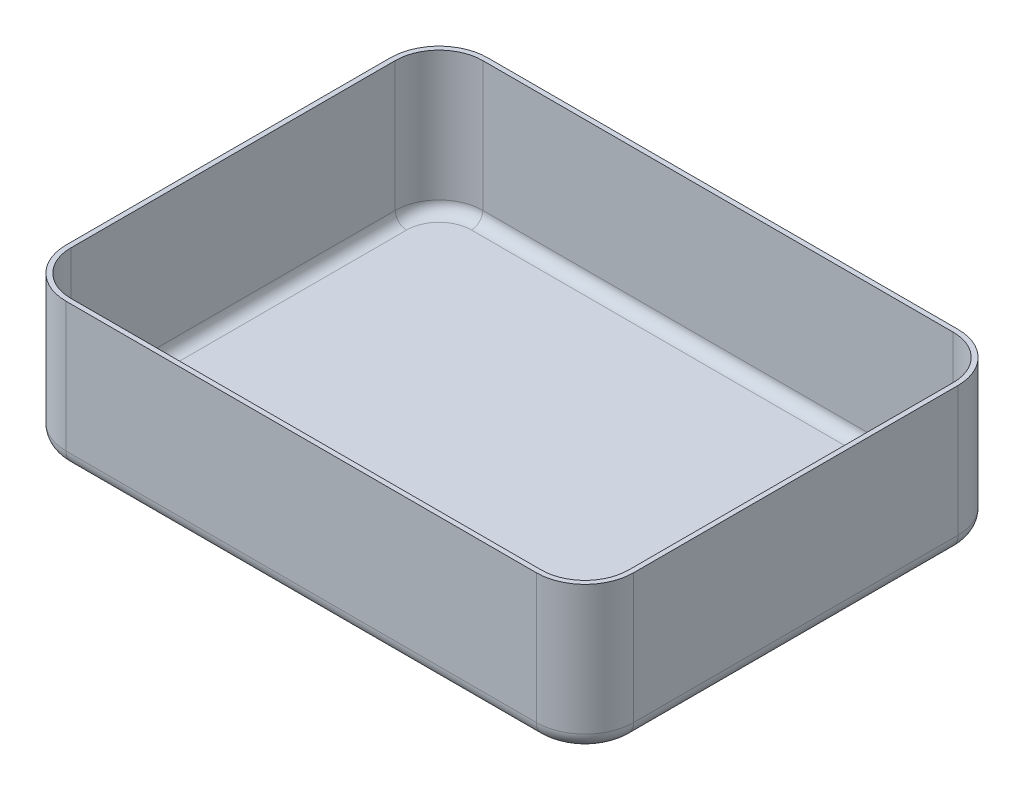
ISO-10303-21;
HEADER;
FILE_DESCRIPTION(('STEP AP214'),'2;1');
FILE_NAME('part.step','',(''),(''),'','','');
FILE_SCHEMA(('AUTOMOTIVE_DESIGN { 1 0 10303 214 1 1 1 1 }'));
ENDSEC;
DATA;
#1=APPLICATION_CONTEXT('core data for automotive mechanical design processes');
#2=APPLICATION_PROTOCOL_DEFINITION('international standard','automotive_design',2000,#1);
#3=PRODUCT_CONTEXT('',#1,'mechanical');
#4=PRODUCT('Part','Part','',(#3));
#5=PRODUCT_RELATED_PRODUCT_CATEGORY('part','',(#4));
#6=PRODUCT_DEFINITION_FORMATION('','',#4);
#7=PRODUCT_DEFINITION_CONTEXT('part definition',#1,'design');
#8=PRODUCT_DEFINITION('design','',#6,#7);
#9=PRODUCT_DEFINITION_SHAPE('','',#8);
#10=(LENGTH_UNIT() NAMED_UNIT(*) SI_UNIT(.MILLI.,.METRE.));
#11=(NAMED_UNIT(*) PLANE_ANGLE_UNIT() SI_UNIT($,.RADIAN.));
#12=(NAMED_UNIT(*) SI_UNIT($,.STERADIAN.) SOLID_ANGLE_UNIT());
#13=UNCERTAINTY_MEASURE_WITH_UNIT(LENGTH_MEASURE(1.E-05),#10,'distance_accuracy_value','');
#14=(GEOMETRIC_REPRESENTATION_CONTEXT(3) GLOBAL_UNCERTAINTY_ASSIGNED_CONTEXT((#13)) GLOBAL_UNIT_ASSIGNED_CONTEXT((#10,
#11,#12)) REPRESENTATION_CONTEXT('',''));
#15=CARTESIAN_POINT('',(0.,0.,0.));
#16=DIRECTION('',(0.,0.,1.));
#17=DIRECTION('',(1.,0.,0.));
#18=AXIS2_PLACEMENT_3D('',#15,#16,#17);
#19=CARTESIAN_POINT('',(175.,90.,130.));
#20=DIRECTION('',(-1.,0.,0.));
#21=DIRECTION('',(0.,0.,1.));
#22=AXIS2_PLACEMENT_3D('',#19,#20,#21);
#23=PLANE('',#22);
#24=DIRECTION('',(0.,-1.,0.));
#25=VECTOR('',#24,1.);
#26=CARTESIAN_POINT('',(175.,90.,100.));
#27=LINE('',#26,#25);
#28=CARTESIAN_POINT('',(175.,90.,100.));
#29=VERTEX_POINT('',#28);
#30=CARTESIAN_POINT('',(175.,9.99999999999999,100.));
#31=VERTEX_POINT('',#30);
#32=EDGE_CURVE('E369',#29,#31,#27,.T.);
#33=ORIENTED_EDGE('',*,*,#32,.T.);
#34=DIRECTION('',(0.,0.,-1.));
#35=VECTOR('',#34,1.);
#36=CARTESIAN_POINT('',(175.,9.99999999999999,-100.));
#37=LINE('',#36,#35);
#38=CARTESIAN_POINT('',(175.,9.99999999999999,-100.));
#39=VERTEX_POINT('',#38);
#40=EDGE_CURVE('E417',#31,#39,#37,.T.);
#41=ORIENTED_EDGE('',*,*,#40,.T.);
#42=DIRECTION('',(0.,-1.,0.));
#43=VECTOR('',#42,1.);
#44=CARTESIAN_POINT('',(175.,90.,-100.));
#45=LINE('',#44,#43);
#46=CARTESIAN_POINT('',(175.,90.,-100.));
#47=VERTEX_POINT('',#46);
#48=EDGE_CURVE('E373',#39,#47,#45,.F.);
#49=ORIENTED_EDGE('',*,*,#48,.T.);
#50=DIRECTION('',(0.,0.,-1.));
#51=VECTOR('',#50,1.);
#52=CARTESIAN_POINT('',(175.,90.,130.));
#53=LINE('',#52,#51);
#54=EDGE_CURVE('E321',#29,#47,#53,.T.);
#55=ORIENTED_EDGE('',*,*,#54,.F.);
#56=EDGE_LOOP('',(#33,#41,#49,#55));
#57=FACE_BOUND('',#56,.T.);
#58=ADVANCED_FACE('F41',(#57),#23,.F.);
#59=CARTESIAN_POINT('',(-175.,90.,-130.));
#60=DIRECTION('',(0.,0.,1.));
#61=DIRECTION('',(1.,0.,0.));
#62=AXIS2_PLACEMENT_3D('',#59,#60,#61);
#63=PLANE('',#62);
#64=DIRECTION('',(0.,-1.,0.));
#65=VECTOR('',#64,1.);
#66=CARTESIAN_POINT('',(145.,90.,-130.));
#67=LINE('',#66,#65);
#68=CARTESIAN_POINT('',(145.,90.,-130.));
#69=VERTEX_POINT('',#68);
#70=CARTESIAN_POINT('',(145.,9.99999999999999,-130.));
#71=VERTEX_POINT('',#70);
#72=EDGE_CURVE('E344',#69,#71,#67,.T.);
#73=ORIENTED_EDGE('',*,*,#72,.T.);
#74=DIRECTION('',(-1.,0.,0.));
#75=VECTOR('',#74,1.);
#76=CARTESIAN_POINT('',(-145.,9.99999999999999,-130.));
#77=LINE('',#76,#75);
#78=CARTESIAN_POINT('',(-145.,9.99999999999999,-130.));
#79=VERTEX_POINT('',#78);
#80=EDGE_CURVE('E411',#71,#79,#77,.T.);
#81=ORIENTED_EDGE('',*,*,#80,.T.);
#82=DIRECTION('',(0.,-1.,0.));
#83=VECTOR('',#82,1.);
#84=CARTESIAN_POINT('',(-145.,90.,-130.));
#85=LINE('',#84,#83);
#86=CARTESIAN_POINT('',(-145.,90.,-130.));
#87=VERTEX_POINT('',#86);
#88=EDGE_CURVE('E348',#79,#87,#85,.F.);
#89=ORIENTED_EDGE('',*,*,#88,.T.);
#90=DIRECTION('',(-1.,0.,0.));
#91=VECTOR('',#90,1.);
#92=CARTESIAN_POINT('',(-175.,90.,-130.));
#93=LINE('',#92,#91);
#94=EDGE_CURVE('E325',#69,#87,#93,.T.);
#95=ORIENTED_EDGE('',*,*,#94,.F.);
#96=EDGE_LOOP('',(#73,#81,#89,#95));
#97=FACE_BOUND('',#96,.T.);
#98=ADVANCED_FACE('F469',(#97),#63,.F.);
#99=CARTESIAN_POINT('',(-175.,90.,130.));
#100=DIRECTION('',(1.,0.,0.));
#101=DIRECTION('',(0.,0.,-1.));
#102=AXIS2_PLACEMENT_3D('',#99,#100,#101);
#103=PLANE('',#102);
#104=DIRECTION('',(0.,-1.,0.));
#105=VECTOR('',#104,1.);
#106=CARTESIAN_POINT('',(-175.,90.,-100.));
#107=LINE('',#106,#105);
#108=CARTESIAN_POINT('',(-175.,90.,-100.));
#109=VERTEX_POINT('',#108);
#110=CARTESIAN_POINT('',(-175.,9.99999999999999,-100.));
#111=VERTEX_POINT('',#110);
#112=EDGE_CURVE('E340',#109,#111,#107,.T.);
#113=ORIENTED_EDGE('',*,*,#112,.T.);
#114=DIRECTION('',(0.,0.,1.));
#115=VECTOR('',#114,1.);
#116=CARTESIAN_POINT('',(-175.,9.99999999999999,100.));
#117=LINE('',#116,#115);
#118=CARTESIAN_POINT('',(-175.,9.99999999999999,100.));
#119=VERTEX_POINT('',#118);
#120=EDGE_CURVE('E405',#111,#119,#117,.T.);
#121=ORIENTED_EDGE('',*,*,#120,.T.);
#122=DIRECTION('',(0.,-1.,0.));
#123=VECTOR('',#122,1.);
#124=CARTESIAN_POINT('',(-175.,90.,100.));
#125=LINE('',#124,#123);
#126=CARTESIAN_POINT('',(-175.,90.,100.));
#127=VERTEX_POINT('',#126);
#128=EDGE_CURVE('E337',#119,#127,#125,.F.);
#129=ORIENTED_EDGE('',*,*,#128,.T.);
#130=DIRECTION('',(0.,0.,1.));
#131=VECTOR('',#130,1.);
#132=CARTESIAN_POINT('',(-175.,90.,130.));
#133=LINE('',#132,#131);
#134=EDGE_CURVE('E329',#109,#127,#133,.T.);
#135=ORIENTED_EDGE('',*,*,#134,.F.);
#136=EDGE_LOOP('',(#113,#121,#129,#135));
#137=FACE_BOUND('',#136,.T.);
#138=ADVANCED_FACE('F482',(#137),#103,.F.);
#139=CARTESIAN_POINT('',(-175.,90.,130.));
#140=DIRECTION('',(0.,0.,-1.));
#141=DIRECTION('',(-1.,0.,0.));
#142=AXIS2_PLACEMENT_3D('',#139,#140,#141);
#143=PLANE('',#142);
#144=DIRECTION('',(0.,-1.,0.));
#145=VECTOR('',#144,1.);
#146=CARTESIAN_POINT('',(-145.,90.,130.));
#147=LINE('',#146,#145);
#148=CARTESIAN_POINT('',(-145.,90.,130.));
#149=VERTEX_POINT('',#148);
#150=CARTESIAN_POINT('',(-145.,9.99999999999999,130.));
#151=VERTEX_POINT('',#150);
#152=EDGE_CURVE('E366',#149,#151,#147,.T.);
#153=ORIENTED_EDGE('',*,*,#152,.T.);
#154=DIRECTION('',(1.,0.,0.));
#155=VECTOR('',#154,1.);
#156=CARTESIAN_POINT('',(145.,9.99999999999999,130.));
#157=LINE('',#156,#155);
#158=CARTESIAN_POINT('',(145.,9.99999999999999,130.));
#159=VERTEX_POINT('',#158);
#160=EDGE_CURVE('E11',#151,#159,#157,.T.);
#161=ORIENTED_EDGE('',*,*,#160,.T.);
#162=DIRECTION('',(0.,-1.,0.));
#163=VECTOR('',#162,1.);
#164=CARTESIAN_POINT('',(145.,90.,130.));
#165=LINE('',#164,#163);
#166=CARTESIAN_POINT('',(145.,90.,130.));
#167=VERTEX_POINT('',#166);
#168=EDGE_CURVE('E363',#159,#167,#165,.F.);
#169=ORIENTED_EDGE('',*,*,#168,.T.);
#170=DIRECTION('',(1.,0.,0.));
#171=VECTOR('',#170,1.);
#172=CARTESIAN_POINT('',(-175.,90.,130.));
#173=LINE('',#172,#171);
#174=EDGE_CURVE('E333',#149,#167,#173,.T.);
#175=ORIENTED_EDGE('',*,*,#174,.F.);
#176=EDGE_LOOP('',(#153,#161,#169,#175));
#177=FACE_BOUND('',#176,.T.);
#178=ADVANCED_FACE('F502',(#177),#143,.F.);
#179=CARTESIAN_POINT('',(0.,90.,0.));
#180=DIRECTION('',(0.,-1.,0.));
#181=DIRECTION('',(0.,0.,-1.));
#182=AXIS2_PLACEMENT_3D('',#179,#180,#181);
#183=PLANE('',#182);
#184=DIRECTION('',(-1.,0.,0.));
#185=VECTOR('',#184,1.);
#186=CARTESIAN_POINT('',(0.,90.,-127.));
#187=LINE('',#186,#185);
#188=CARTESIAN_POINT('',(145.,90.,-127.));
#189=VERTEX_POINT('',#188);
#190=CARTESIAN_POINT('',(-145.,90.,-127.));
#191=VERTEX_POINT('',#190);
#192=EDGE_CURVE('E245',#189,#191,#187,.T.);
#193=ORIENTED_EDGE('',*,*,#192,.F.);
#194=CARTESIAN_POINT('',(145.,90.,-100.));
#195=DIRECTION('',(0.,-1.,0.));
#196=DIRECTION('',(0.,0.,-1.));
#197=AXIS2_PLACEMENT_3D('',#194,#195,#196);
#198=CIRCLE('',#197,27.);
#199=CARTESIAN_POINT('',(172.,90.,-100.));
#200=VERTEX_POINT('',#199);
#201=EDGE_CURVE('E295',#200,#189,#198,.F.);
#202=ORIENTED_EDGE('',*,*,#201,.F.);
#203=DIRECTION('',(0.,0.,-1.));
#204=VECTOR('',#203,1.);
#205=CARTESIAN_POINT('',(172.,90.,0.));
#206=LINE('',#205,#204);
#207=CARTESIAN_POINT('',(172.,90.,100.));
#208=VERTEX_POINT('',#207);
#209=EDGE_CURVE('E59',#208,#200,#206,.T.);
#210=ORIENTED_EDGE('',*,*,#209,.F.);
#211=CARTESIAN_POINT('',(145.,90.,100.));
#212=DIRECTION('',(0.,-1.,0.));
#213=DIRECTION('',(0.,0.,-1.));
#214=AXIS2_PLACEMENT_3D('',#211,#212,#213);
#215=CIRCLE('',#214,27.);
#216=CARTESIAN_POINT('',(145.,90.,127.));
#217=VERTEX_POINT('',#216);
#218=EDGE_CURVE('E299',#217,#208,#215,.F.);
#219=ORIENTED_EDGE('',*,*,#218,.F.);
#220=DIRECTION('',(1.,0.,0.));
#221=VECTOR('',#220,1.);
#222=CARTESIAN_POINT('',(0.,90.,127.));
#223=LINE('',#222,#221);
#224=CARTESIAN_POINT('',(-145.,90.,127.));
#225=VERTEX_POINT('',#224);
#226=EDGE_CURVE('E311',#225,#217,#223,.T.);
#227=ORIENTED_EDGE('',*,*,#226,.F.);
#228=CARTESIAN_POINT('',(-145.,90.,100.));
#229=DIRECTION('',(0.,-1.,0.));
#230=DIRECTION('',(0.,0.,-1.));
#231=AXIS2_PLACEMENT_3D('',#228,#229,#230);
#232=CIRCLE('',#231,27.);
#233=CARTESIAN_POINT('',(-172.,90.,100.));
#234=VERTEX_POINT('',#233);
#235=EDGE_CURVE('E298',#234,#225,#232,.F.);
#236=ORIENTED_EDGE('',*,*,#235,.F.);
#237=DIRECTION('',(0.,0.,1.));
#238=VECTOR('',#237,1.);
#239=CARTESIAN_POINT('',(-172.,90.,0.));
#240=LINE('',#239,#238);
#241=CARTESIAN_POINT('',(-172.,90.,-100.));
#242=VERTEX_POINT('',#241);
#243=EDGE_CURVE('E303',#242,#234,#240,.T.);
#244=ORIENTED_EDGE('',*,*,#243,.F.);
#245=CARTESIAN_POINT('',(-145.,90.,-100.));
#246=DIRECTION('',(0.,-1.,0.));
#247=DIRECTION('',(0.,0.,-1.));
#248=AXIS2_PLACEMENT_3D('',#245,#246,#247);
#249=CIRCLE('',#248,27.);
#250=EDGE_CURVE('E304',#191,#242,#249,.F.);
#251=ORIENTED_EDGE('',*,*,#250,.F.);
#252=EDGE_LOOP('',(#193,#202,#210,#219,#227,#236,#244,#251));
#253=FACE_BOUND('',#252,.T.);
#254=ORIENTED_EDGE('',*,*,#94,.T.);
#255=CARTESIAN_POINT('',(-145.,90.,-100.));
#256=DIRECTION('',(0.,-1.,0.));
#257=DIRECTION('',(0.,0.,-1.));
#258=AXIS2_PLACEMENT_3D('',#255,#256,#257);
#259=CIRCLE('',#258,30.);
#260=EDGE_CURVE('E360',#87,#109,#259,.F.);
#261=ORIENTED_EDGE('',*,*,#260,.T.);
#262=ORIENTED_EDGE('',*,*,#134,.T.);
#263=CARTESIAN_POINT('',(-145.,90.,100.));
#264=DIRECTION('',(0.,-1.,0.));
#265=DIRECTION('',(0.,0.,-1.));
#266=AXIS2_PLACEMENT_3D('',#263,#264,#265);
#267=CIRCLE('',#266,30.);
#268=EDGE_CURVE('E357',#127,#149,#267,.F.);
#269=ORIENTED_EDGE('',*,*,#268,.T.);
#270=ORIENTED_EDGE('',*,*,#174,.T.);
#271=CARTESIAN_POINT('',(145.,90.,100.));
#272=DIRECTION('',(0.,-1.,0.));
#273=DIRECTION('',(0.,0.,-1.));
#274=AXIS2_PLACEMENT_3D('',#271,#272,#273);
#275=CIRCLE('',#274,30.);
#276=EDGE_CURVE('E351',#167,#29,#275,.F.);
#277=ORIENTED_EDGE('',*,*,#276,.T.);
#278=ORIENTED_EDGE('',*,*,#54,.T.);
#279=CARTESIAN_POINT('',(145.,90.,-100.));
#280=DIRECTION('',(0.,-1.,0.));
#281=DIRECTION('',(0.,0.,-1.));
#282=AXIS2_PLACEMENT_3D('',#279,#280,#281);
#283=CIRCLE('',#282,30.);
#284=EDGE_CURVE('E354',#47,#69,#283,.F.);
#285=ORIENTED_EDGE('',*,*,#284,.T.);
#286=EDGE_LOOP('',(#254,#261,#262,#269,#270,#277,#278,#285));
#287=FACE_BOUND('',#286,.T.);
#288=ADVANCED_FACE('F473',(#253,#287),#183,.F.);
#289=CARTESIAN_POINT('',(0.,0.,0.));
#290=DIRECTION('',(0.,-1.,0.));
#291=DIRECTION('',(0.,0.,-1.));
#292=AXIS2_PLACEMENT_3D('',#289,#290,#291);
#293=PLANE('',#292);
#294=DIRECTION('',(1.,0.,0.));
#295=VECTOR('',#294,1.);
#296=CARTESIAN_POINT('',(-145.,0.,120.));
#297=LINE('',#296,#295);
#298=CARTESIAN_POINT('',(145.,0.,120.));
#299=VERTEX_POINT('',#298);
#300=CARTESIAN_POINT('',(-145.,0.,120.));
#301=VERTEX_POINT('',#300);
#302=EDGE_CURVE('E376',#299,#301,#297,.F.);
#303=ORIENTED_EDGE('',*,*,#302,.T.);
#304=CARTESIAN_POINT('',(-145.,0.,100.));
#305=DIRECTION('',(0.,-1.,0.));
#306=DIRECTION('',(0.,0.,-1.));
#307=AXIS2_PLACEMENT_3D('',#304,#305,#306);
#308=CIRCLE('',#307,20.);
#309=CARTESIAN_POINT('',(-165.,0.,100.));
#310=VERTEX_POINT('',#309);
#311=EDGE_CURVE('E397',#301,#310,#308,.T.);
#312=ORIENTED_EDGE('',*,*,#311,.T.);
#313=DIRECTION('',(0.,0.,1.));
#314=VECTOR('',#313,1.);
#315=CARTESIAN_POINT('',(-165.,0.,-100.));
#316=LINE('',#315,#314);
#317=CARTESIAN_POINT('',(-165.,0.,-100.));
#318=VERTEX_POINT('',#317);
#319=EDGE_CURVE('E394',#310,#318,#316,.F.);
#320=ORIENTED_EDGE('',*,*,#319,.T.);
#321=CARTESIAN_POINT('',(-145.,0.,-100.));
#322=DIRECTION('',(0.,-1.,0.));
#323=DIRECTION('',(0.,0.,-1.));
#324=AXIS2_PLACEMENT_3D('',#321,#322,#323);
#325=CIRCLE('',#324,20.);
#326=CARTESIAN_POINT('',(-145.,0.,-120.));
#327=VERTEX_POINT('',#326);
#328=EDGE_CURVE('E391',#318,#327,#325,.T.);
#329=ORIENTED_EDGE('',*,*,#328,.T.);
#330=DIRECTION('',(-1.,0.,0.));
#331=VECTOR('',#330,1.);
#332=CARTESIAN_POINT('',(145.,0.,-120.));
#333=LINE('',#332,#331);
#334=CARTESIAN_POINT('',(145.,0.,-120.));
#335=VERTEX_POINT('',#334);
#336=EDGE_CURVE('E388',#327,#335,#333,.F.);
#337=ORIENTED_EDGE('',*,*,#336,.T.);
#338=CARTESIAN_POINT('',(145.,0.,-100.));
#339=DIRECTION('',(0.,-1.,0.));
#340=DIRECTION('',(0.,0.,-1.));
#341=AXIS2_PLACEMENT_3D('',#338,#339,#340);
#342=CIRCLE('',#341,20.);
#343=CARTESIAN_POINT('',(165.,0.,-100.));
#344=VERTEX_POINT('',#343);
#345=EDGE_CURVE('E385',#335,#344,#342,.T.);
#346=ORIENTED_EDGE('',*,*,#345,.T.);
#347=DIRECTION('',(0.,0.,-1.));
#348=VECTOR('',#347,1.);
#349=CARTESIAN_POINT('',(165.,0.,100.));
#350=LINE('',#349,#348);
#351=CARTESIAN_POINT('',(165.,0.,100.));
#352=VERTEX_POINT('',#351);
#353=EDGE_CURVE('E382',#344,#352,#350,.F.);
#354=ORIENTED_EDGE('',*,*,#353,.T.);
#355=CARTESIAN_POINT('',(145.,0.,100.));
#356=DIRECTION('',(0.,-1.,0.));
#357=DIRECTION('',(0.,0.,-1.));
#358=AXIS2_PLACEMENT_3D('',#355,#356,#357);
#359=CIRCLE('',#358,20.);
#360=EDGE_CURVE('E379',#352,#299,#359,.T.);
#361=ORIENTED_EDGE('',*,*,#360,.T.);
#362=EDGE_LOOP('',(#303,#312,#320,#329,#337,#346,#354,#361));
#363=FACE_BOUND('',#362,.T.);
#364=ADVANCED_FACE('F520',(#363),#293,.T.);
#365=CARTESIAN_POINT('',(-145.,90.,-100.));
#366=DIRECTION('',(0.,-1.,0.));
#367=DIRECTION('',(0.,0.,-1.));
#368=AXIS2_PLACEMENT_3D('',#365,#366,#367);
#369=CYLINDRICAL_SURFACE('',#368,30.);
#370=ORIENTED_EDGE('',*,*,#88,.F.);
#371=CARTESIAN_POINT('',(-145.,9.99999999999999,-100.));
#372=DIRECTION('',(0.,-1.,0.));
#373=DIRECTION('',(0.,0.,-1.));
#374=AXIS2_PLACEMENT_3D('',#371,#372,#373);
#375=CIRCLE('',#374,30.);
#376=EDGE_CURVE('E408',#79,#111,#375,.F.);
#377=ORIENTED_EDGE('',*,*,#376,.T.);
#378=ORIENTED_EDGE('',*,*,#112,.F.);
#379=ORIENTED_EDGE('',*,*,#260,.F.);
#380=EDGE_LOOP('',(#370,#377,#378,#379));
#381=FACE_BOUND('',#380,.T.);
#382=ADVANCED_FACE('F477',(#381),#369,.T.);
#383=CARTESIAN_POINT('',(-145.,90.,100.));
#384=DIRECTION('',(0.,-1.,0.));
#385=DIRECTION('',(0.,0.,-1.));
#386=AXIS2_PLACEMENT_3D('',#383,#384,#385);
#387=CYLINDRICAL_SURFACE('',#386,30.);
#388=ORIENTED_EDGE('',*,*,#128,.F.);
#389=CARTESIAN_POINT('',(-145.,9.99999999999999,100.));
#390=DIRECTION('',(0.,-1.,0.));
#391=DIRECTION('',(0.,0.,-1.));
#392=AXIS2_PLACEMENT_3D('',#389,#390,#391);
#393=CIRCLE('',#392,30.);
#394=EDGE_CURVE('E401',#119,#151,#393,.F.);
#395=ORIENTED_EDGE('',*,*,#394,.T.);
#396=ORIENTED_EDGE('',*,*,#152,.F.);
#397=ORIENTED_EDGE('',*,*,#268,.F.);
#398=EDGE_LOOP('',(#388,#395,#396,#397));
#399=FACE_BOUND('',#398,.T.);
#400=ADVANCED_FACE('F499',(#399),#387,.T.);
#401=CARTESIAN_POINT('',(145.,90.,-100.));
#402=DIRECTION('',(0.,-1.,0.));
#403=DIRECTION('',(0.,0.,-1.));
#404=AXIS2_PLACEMENT_3D('',#401,#402,#403);
#405=CYLINDRICAL_SURFACE('',#404,30.);
#406=ORIENTED_EDGE('',*,*,#48,.F.);
#407=CARTESIAN_POINT('',(145.,9.99999999999999,-100.));
#408=DIRECTION('',(0.,-1.,0.));
#409=DIRECTION('',(0.,0.,-1.));
#410=AXIS2_PLACEMENT_3D('',#407,#408,#409);
#411=CIRCLE('',#410,30.);
#412=EDGE_CURVE('E414',#39,#71,#411,.F.);
#413=ORIENTED_EDGE('',*,*,#412,.T.);
#414=ORIENTED_EDGE('',*,*,#72,.F.);
#415=ORIENTED_EDGE('',*,*,#284,.F.);
#416=EDGE_LOOP('',(#406,#413,#414,#415));
#417=FACE_BOUND('',#416,.T.);
#418=ADVANCED_FACE('F465',(#417),#405,.T.);
#419=CARTESIAN_POINT('',(145.,90.,100.));
#420=DIRECTION('',(0.,-1.,0.));
#421=DIRECTION('',(0.,0.,-1.));
#422=AXIS2_PLACEMENT_3D('',#419,#420,#421);
#423=CYLINDRICAL_SURFACE('',#422,30.);
#424=ORIENTED_EDGE('',*,*,#168,.F.);
#425=CARTESIAN_POINT('',(145.,9.99999999999999,100.));
#426=DIRECTION('',(0.,-1.,0.));
#427=DIRECTION('',(0.,0.,-1.));
#428=AXIS2_PLACEMENT_3D('',#425,#426,#427);
#429=CIRCLE('',#428,30.);
#430=EDGE_CURVE('E51',#159,#31,#429,.F.);
#431=ORIENTED_EDGE('',*,*,#430,.T.);
#432=ORIENTED_EDGE('',*,*,#32,.F.);
#433=ORIENTED_EDGE('',*,*,#276,.F.);
#434=EDGE_LOOP('',(#424,#431,#432,#433));
#435=FACE_BOUND('',#434,.T.);
#436=ADVANCED_FACE('F507',(#435),#423,.T.);
#437=CARTESIAN_POINT('',(145.,9.99999999999999,-100.));
#438=DIRECTION('',(0.,-1.,0.));
#439=DIRECTION('',(0.,0.,-1.));
#440=AXIS2_PLACEMENT_3D('',#437,#438,#439);
#441=TOROIDAL_SURFACE('',#440,20.,10.);
#442=CARTESIAN_POINT('',(145.,9.99999999999999,-120.));
#443=DIRECTION('',(-1.,0.,0.));
#444=DIRECTION('',(0.,0.,1.));
#445=AXIS2_PLACEMENT_3D('',#442,#443,#444);
#446=CIRCLE('',#445,10.);
#447=EDGE_CURVE('E444',#71,#335,#446,.T.);
#448=ORIENTED_EDGE('',*,*,#447,.F.);
#449=ORIENTED_EDGE('',*,*,#412,.F.);
#450=CARTESIAN_POINT('',(165.,10.,-100.));
#451=DIRECTION('',(0.,0.,1.));
#452=DIRECTION('',(1.,0.,0.));
#453=AXIS2_PLACEMENT_3D('',#450,#451,#452);
#454=CIRCLE('',#453,10.);
#455=EDGE_CURVE('E45',#344,#39,#454,.T.);
#456=ORIENTED_EDGE('',*,*,#455,.F.);
#457=ORIENTED_EDGE('',*,*,#345,.F.);
#458=EDGE_LOOP('',(#448,#449,#456,#457));
#459=FACE_BOUND('',#458,.T.);
#460=ADVANCED_FACE('F43',(#459),#441,.T.);
#461=CARTESIAN_POINT('',(165.,9.99999999999999,130.));
#462=DIRECTION('',(0.,0.,1.));
#463=DIRECTION('',(1.,0.,0.));
#464=AXIS2_PLACEMENT_3D('',#461,#462,#463);
#465=CYLINDRICAL_SURFACE('',#464,10.);
#466=ORIENTED_EDGE('',*,*,#455,.T.);
#467=ORIENTED_EDGE('',*,*,#40,.F.);
#468=CARTESIAN_POINT('',(165.,10.,100.));
#469=DIRECTION('',(0.,0.,1.));
#470=DIRECTION('',(1.,0.,0.));
#471=AXIS2_PLACEMENT_3D('',#468,#469,#470);
#472=CIRCLE('',#471,10.);
#473=EDGE_CURVE('E441',#352,#31,#472,.T.);
#474=ORIENTED_EDGE('',*,*,#473,.F.);
#475=ORIENTED_EDGE('',*,*,#353,.F.);
#476=EDGE_LOOP('',(#466,#467,#474,#475));
#477=FACE_BOUND('',#476,.T.);
#478=ADVANCED_FACE('F457',(#477),#465,.T.);
#479=CARTESIAN_POINT('',(-175.,9.99999999999999,-120.));
#480=DIRECTION('',(1.,0.,0.));
#481=DIRECTION('',(0.,0.,-1.));
#482=AXIS2_PLACEMENT_3D('',#479,#480,#481);
#483=CYLINDRICAL_SURFACE('',#482,10.);
#484=ORIENTED_EDGE('',*,*,#447,.T.);
#485=ORIENTED_EDGE('',*,*,#336,.F.);
#486=CARTESIAN_POINT('',(-145.,9.99999999999999,-120.));
#487=DIRECTION('',(-1.,0.,0.));
#488=DIRECTION('',(0.,0.,1.));
#489=AXIS2_PLACEMENT_3D('',#486,#487,#488);
#490=CIRCLE('',#489,10.);
#491=EDGE_CURVE('E437',#79,#327,#490,.T.);
#492=ORIENTED_EDGE('',*,*,#491,.F.);
#493=ORIENTED_EDGE('',*,*,#80,.F.);
#494=EDGE_LOOP('',(#484,#485,#492,#493));
#495=FACE_BOUND('',#494,.T.);
#496=ADVANCED_FACE('F540',(#495),#483,.T.);
#497=CARTESIAN_POINT('',(145.,9.99999999999999,100.));
#498=DIRECTION('',(0.,-1.,0.));
#499=DIRECTION('',(0.,0.,-1.));
#500=AXIS2_PLACEMENT_3D('',#497,#498,#499);
#501=TOROIDAL_SURFACE('',#500,20.,10.);
#502=ORIENTED_EDGE('',*,*,#473,.T.);
#503=ORIENTED_EDGE('',*,*,#430,.F.);
#504=CARTESIAN_POINT('',(145.,10.,120.));
#505=DIRECTION('',(-1.,0.,0.));
#506=DIRECTION('',(0.,0.,1.));
#507=AXIS2_PLACEMENT_3D('',#504,#505,#506);
#508=CIRCLE('',#507,10.);
#509=EDGE_CURVE('E433',#299,#159,#508,.T.);
#510=ORIENTED_EDGE('',*,*,#509,.F.);
#511=ORIENTED_EDGE('',*,*,#360,.F.);
#512=EDGE_LOOP('',(#502,#503,#510,#511));
#513=FACE_BOUND('',#512,.T.);
#514=ADVANCED_FACE('F537',(#513),#501,.T.);
#515=CARTESIAN_POINT('',(-145.,9.99999999999999,-100.));
#516=DIRECTION('',(0.,-1.,0.));
#517=DIRECTION('',(0.,0.,-1.));
#518=AXIS2_PLACEMENT_3D('',#515,#516,#517);
#519=TOROIDAL_SURFACE('',#518,20.,10.);
#520=ORIENTED_EDGE('',*,*,#491,.T.);
#521=ORIENTED_EDGE('',*,*,#328,.F.);
#522=CARTESIAN_POINT('',(-165.,9.99999999999999,-100.));
#523=DIRECTION('',(0.,0.,1.));
#524=DIRECTION('',(1.,0.,0.));
#525=AXIS2_PLACEMENT_3D('',#522,#523,#524);
#526=CIRCLE('',#525,10.);
#527=EDGE_CURVE('E429',#111,#318,#526,.T.);
#528=ORIENTED_EDGE('',*,*,#527,.F.);
#529=ORIENTED_EDGE('',*,*,#376,.F.);
#530=EDGE_LOOP('',(#520,#521,#528,#529));
#531=FACE_BOUND('',#530,.T.);
#532=ADVANCED_FACE('F487',(#531),#519,.T.);
#533=CARTESIAN_POINT('',(-175.,9.99999999999999,120.));
#534=DIRECTION('',(-1.,0.,0.));
#535=DIRECTION('',(0.,0.,1.));
#536=AXIS2_PLACEMENT_3D('',#533,#534,#535);
#537=CYLINDRICAL_SURFACE('',#536,10.);
#538=ORIENTED_EDGE('',*,*,#509,.T.);
#539=ORIENTED_EDGE('',*,*,#160,.F.);
#540=CARTESIAN_POINT('',(-145.,10.,120.));
#541=DIRECTION('',(-1.,0.,0.));
#542=DIRECTION('',(0.,0.,1.));
#543=AXIS2_PLACEMENT_3D('',#540,#541,#542);
#544=CIRCLE('',#543,10.);
#545=EDGE_CURVE('E425',#301,#151,#544,.T.);
#546=ORIENTED_EDGE('',*,*,#545,.F.);
#547=ORIENTED_EDGE('',*,*,#302,.F.);
#548=EDGE_LOOP('',(#538,#539,#546,#547));
#549=FACE_BOUND('',#548,.T.);
#550=ADVANCED_FACE('F531',(#549),#537,.T.);
#551=CARTESIAN_POINT('',(-165.,9.99999999999999,130.));
#552=DIRECTION('',(0.,0.,-1.));
#553=DIRECTION('',(-1.,0.,0.));
#554=AXIS2_PLACEMENT_3D('',#551,#552,#553);
#555=CYLINDRICAL_SURFACE('',#554,10.);
#556=ORIENTED_EDGE('',*,*,#527,.T.);
#557=ORIENTED_EDGE('',*,*,#319,.F.);
#558=CARTESIAN_POINT('',(-165.,9.99999999999999,100.));
#559=DIRECTION('',(0.,0.,1.));
#560=DIRECTION('',(1.,0.,0.));
#561=AXIS2_PLACEMENT_3D('',#558,#559,#560);
#562=CIRCLE('',#561,10.);
#563=EDGE_CURVE('E422',#119,#310,#562,.T.);
#564=ORIENTED_EDGE('',*,*,#563,.F.);
#565=ORIENTED_EDGE('',*,*,#120,.F.);
#566=EDGE_LOOP('',(#556,#557,#564,#565));
#567=FACE_BOUND('',#566,.T.);
#568=ADVANCED_FACE('F491',(#567),#555,.T.);
#569=CARTESIAN_POINT('',(-145.,9.99999999999999,100.));
#570=DIRECTION('',(0.,-1.,0.));
#571=DIRECTION('',(0.,0.,-1.));
#572=AXIS2_PLACEMENT_3D('',#569,#570,#571);
#573=TOROIDAL_SURFACE('',#572,20.,10.);
#574=ORIENTED_EDGE('',*,*,#545,.T.);
#575=ORIENTED_EDGE('',*,*,#394,.F.);
#576=ORIENTED_EDGE('',*,*,#563,.T.);
#577=ORIENTED_EDGE('',*,*,#311,.F.);
#578=EDGE_LOOP('',(#574,#575,#576,#577));
#579=FACE_BOUND('',#578,.T.);
#580=ADVANCED_FACE('F495',(#579),#573,.T.);
#581=CARTESIAN_POINT('',(172.,90.,130.));
#582=DIRECTION('',(-1.,0.,0.));
#583=DIRECTION('',(0.,0.,1.));
#584=AXIS2_PLACEMENT_3D('',#581,#582,#583);
#585=PLANE('',#584);
#586=DIRECTION('',(0.,1.,0.));
#587=VECTOR('',#586,1.);
#588=CARTESIAN_POINT('',(172.,90.,100.));
#589=LINE('',#588,#587);
#590=CARTESIAN_POINT('',(172.,9.99999999999999,100.));
#591=VERTEX_POINT('',#590);
#592=EDGE_CURVE('E225',#208,#591,#589,.F.);
#593=ORIENTED_EDGE('',*,*,#592,.F.);
#594=ORIENTED_EDGE('',*,*,#209,.T.);
#595=DIRECTION('',(0.,1.,0.));
#596=VECTOR('',#595,1.);
#597=CARTESIAN_POINT('',(172.,90.,-100.));
#598=LINE('',#597,#596);
#599=CARTESIAN_POINT('',(172.,10.,-100.));
#600=VERTEX_POINT('',#599);
#601=EDGE_CURVE('E218',#600,#200,#598,.T.);
#602=ORIENTED_EDGE('',*,*,#601,.F.);
#603=DIRECTION('',(0.,0.,1.));
#604=VECTOR('',#603,1.);
#605=CARTESIAN_POINT('',(172.,10.,130.));
#606=LINE('',#605,#604);
#607=EDGE_CURVE('E207',#591,#600,#606,.F.);
#608=ORIENTED_EDGE('',*,*,#607,.F.);
#609=EDGE_LOOP('',(#593,#594,#602,#608));
#610=FACE_BOUND('',#609,.T.);
#611=ADVANCED_FACE('F220',(#610),#585,.T.);
#612=CARTESIAN_POINT('',(-175.,90.,-127.));
#613=DIRECTION('',(0.,0.,1.));
#614=DIRECTION('',(1.,0.,0.));
#615=AXIS2_PLACEMENT_3D('',#612,#613,#614);
#616=PLANE('',#615);
#617=DIRECTION('',(0.,1.,0.));
#618=VECTOR('',#617,1.);
#619=CARTESIAN_POINT('',(145.,90.,-127.));
#620=LINE('',#619,#618);
#621=CARTESIAN_POINT('',(145.,9.99999999999999,-127.));
#622=VERTEX_POINT('',#621);
#623=EDGE_CURVE('E230',#189,#622,#620,.F.);
#624=ORIENTED_EDGE('',*,*,#623,.F.);
#625=ORIENTED_EDGE('',*,*,#192,.T.);
#626=DIRECTION('',(0.,1.,0.));
#627=VECTOR('',#626,1.);
#628=CARTESIAN_POINT('',(-145.,90.,-127.));
#629=LINE('',#628,#627);
#630=CARTESIAN_POINT('',(-145.,10.,-127.));
#631=VERTEX_POINT('',#630);
#632=EDGE_CURVE('E320',#631,#191,#629,.T.);
#633=ORIENTED_EDGE('',*,*,#632,.F.);
#634=DIRECTION('',(1.,0.,0.));
#635=VECTOR('',#634,1.);
#636=CARTESIAN_POINT('',(-175.,10.,-127.));
#637=LINE('',#636,#635);
#638=EDGE_CURVE('E235',#622,#631,#637,.F.);
#639=ORIENTED_EDGE('',*,*,#638,.F.);
#640=EDGE_LOOP('',(#624,#625,#633,#639));
#641=FACE_BOUND('',#640,.T.);
#642=ADVANCED_FACE('F669',(#641),#616,.T.);
#643=CARTESIAN_POINT('',(-172.,90.,130.));
#644=DIRECTION('',(1.,0.,0.));
#645=DIRECTION('',(0.,0.,-1.));
#646=AXIS2_PLACEMENT_3D('',#643,#644,#645);
#647=PLANE('',#646);
#648=DIRECTION('',(0.,1.,0.));
#649=VECTOR('',#648,1.);
#650=CARTESIAN_POINT('',(-172.,90.,-100.));
#651=LINE('',#650,#649);
#652=CARTESIAN_POINT('',(-172.,9.99999999999999,-100.));
#653=VERTEX_POINT('',#652);
#654=EDGE_CURVE('E861',#242,#653,#651,.F.);
#655=ORIENTED_EDGE('',*,*,#654,.F.);
#656=ORIENTED_EDGE('',*,*,#243,.T.);
#657=DIRECTION('',(0.,1.,0.));
#658=VECTOR('',#657,1.);
#659=CARTESIAN_POINT('',(-172.,90.,100.));
#660=LINE('',#659,#658);
#661=CARTESIAN_POINT('',(-172.,10.,100.));
#662=VERTEX_POINT('',#661);
#663=EDGE_CURVE('E317',#662,#234,#660,.T.);
#664=ORIENTED_EDGE('',*,*,#663,.F.);
#665=DIRECTION('',(0.,0.,-1.));
#666=VECTOR('',#665,1.);
#667=CARTESIAN_POINT('',(-172.,10.,130.));
#668=LINE('',#667,#666);
#669=EDGE_CURVE('E852',#653,#662,#668,.F.);
#670=ORIENTED_EDGE('',*,*,#669,.F.);
#671=EDGE_LOOP('',(#655,#656,#664,#670));
#672=FACE_BOUND('',#671,.T.);
#673=ADVANCED_FACE('F677',(#672),#647,.T.);
#674=CARTESIAN_POINT('',(-175.,90.,127.));
#675=DIRECTION('',(0.,0.,-1.));
#676=DIRECTION('',(-1.,0.,0.));
#677=AXIS2_PLACEMENT_3D('',#674,#675,#676);
#678=PLANE('',#677);
#679=DIRECTION('',(0.,1.,0.));
#680=VECTOR('',#679,1.);
#681=CARTESIAN_POINT('',(-145.,90.,127.));
#682=LINE('',#681,#680);
#683=CARTESIAN_POINT('',(-145.,9.99999999999999,127.));
#684=VERTEX_POINT('',#683);
#685=EDGE_CURVE('E864',#225,#684,#682,.F.);
#686=ORIENTED_EDGE('',*,*,#685,.F.);
#687=ORIENTED_EDGE('',*,*,#226,.T.);
#688=DIRECTION('',(0.,1.,0.));
#689=VECTOR('',#688,1.);
#690=CARTESIAN_POINT('',(145.,90.,127.));
#691=LINE('',#690,#689);
#692=CARTESIAN_POINT('',(145.,10.,127.));
#693=VERTEX_POINT('',#692);
#694=EDGE_CURVE('E307',#693,#217,#691,.T.);
#695=ORIENTED_EDGE('',*,*,#694,.F.);
#696=DIRECTION('',(-1.,0.,0.));
#697=VECTOR('',#696,1.);
#698=CARTESIAN_POINT('',(-175.,10.,127.));
#699=LINE('',#698,#697);
#700=EDGE_CURVE('E426',#684,#693,#699,.F.);
#701=ORIENTED_EDGE('',*,*,#700,.F.);
#702=EDGE_LOOP('',(#686,#687,#695,#701));
#703=FACE_BOUND('',#702,.T.);
#704=ADVANCED_FACE('F686',(#703),#678,.T.);
#705=CARTESIAN_POINT('',(0.,3.,0.));
#706=DIRECTION('',(0.,-1.,0.));
#707=DIRECTION('',(0.,0.,-1.));
#708=AXIS2_PLACEMENT_3D('',#705,#706,#707);
#709=PLANE('',#708);
#710=DIRECTION('',(1.,0.,0.));
#711=VECTOR('',#710,1.);
#712=CARTESIAN_POINT('',(0.,3.,120.));
#713=LINE('',#712,#711);
#714=CARTESIAN_POINT('',(145.,3.,120.));
#715=VERTEX_POINT('',#714);
#716=CARTESIAN_POINT('',(-145.,3.,120.));
#717=VERTEX_POINT('',#716);
#718=EDGE_CURVE('E224',#715,#717,#713,.F.);
#719=ORIENTED_EDGE('',*,*,#718,.F.);
#720=CARTESIAN_POINT('',(145.,2.99999999999999,100.));
#721=DIRECTION('',(0.,-1.,0.));
#722=DIRECTION('',(0.,0.,-1.));
#723=AXIS2_PLACEMENT_3D('',#720,#721,#722);
#724=CIRCLE('',#723,20.);
#725=CARTESIAN_POINT('',(165.,3.,100.));
#726=VERTEX_POINT('',#725);
#727=EDGE_CURVE('E257',#726,#715,#724,.T.);
#728=ORIENTED_EDGE('',*,*,#727,.F.);
#729=DIRECTION('',(0.,0.,-1.));
#730=VECTOR('',#729,1.);
#731=CARTESIAN_POINT('',(165.,3.,0.));
#732=LINE('',#731,#730);
#733=CARTESIAN_POINT('',(165.,3.,-100.));
#734=VERTEX_POINT('',#733);
#735=EDGE_CURVE('E254',#734,#726,#732,.F.);
#736=ORIENTED_EDGE('',*,*,#735,.F.);
#737=CARTESIAN_POINT('',(145.,2.99999999999999,-100.));
#738=DIRECTION('',(0.,-1.,0.));
#739=DIRECTION('',(0.,0.,-1.));
#740=AXIS2_PLACEMENT_3D('',#737,#738,#739);
#741=CIRCLE('',#740,20.);
#742=CARTESIAN_POINT('',(145.,3.,-120.));
#743=VERTEX_POINT('',#742);
#744=EDGE_CURVE('E239',#743,#734,#741,.T.);
#745=ORIENTED_EDGE('',*,*,#744,.F.);
#746=DIRECTION('',(1.,0.,0.));
#747=VECTOR('',#746,1.);
#748=CARTESIAN_POINT('',(0.,3.,-120.));
#749=LINE('',#748,#747);
#750=CARTESIAN_POINT('',(-145.,3.,-120.));
#751=VERTEX_POINT('',#750);
#752=EDGE_CURVE('E271',#751,#743,#749,.T.);
#753=ORIENTED_EDGE('',*,*,#752,.F.);
#754=CARTESIAN_POINT('',(-145.,2.99999999999999,-100.));
#755=DIRECTION('',(0.,-1.,0.));
#756=DIRECTION('',(0.,0.,-1.));
#757=AXIS2_PLACEMENT_3D('',#754,#755,#756);
#758=CIRCLE('',#757,20.);
#759=CARTESIAN_POINT('',(-165.,3.,-100.));
#760=VERTEX_POINT('',#759);
#761=EDGE_CURVE('E268',#760,#751,#758,.T.);
#762=ORIENTED_EDGE('',*,*,#761,.F.);
#763=DIRECTION('',(0.,0.,-1.));
#764=VECTOR('',#763,1.);
#765=CARTESIAN_POINT('',(-165.,3.,0.));
#766=LINE('',#765,#764);
#767=CARTESIAN_POINT('',(-165.,2.99999999999999,100.));
#768=VERTEX_POINT('',#767);
#769=EDGE_CURVE('E265',#768,#760,#766,.T.);
#770=ORIENTED_EDGE('',*,*,#769,.F.);
#771=CARTESIAN_POINT('',(-145.,2.99999999999999,100.));
#772=DIRECTION('',(0.,-1.,0.));
#773=DIRECTION('',(0.,0.,-1.));
#774=AXIS2_PLACEMENT_3D('',#771,#772,#773);
#775=CIRCLE('',#774,20.);
#776=EDGE_CURVE('E260',#717,#768,#775,.T.);
#777=ORIENTED_EDGE('',*,*,#776,.F.);
#778=EDGE_LOOP('',(#719,#728,#736,#745,#753,#762,#770,#777));
#779=FACE_BOUND('',#778,.T.);
#780=ADVANCED_FACE('F695',(#779),#709,.F.);
#781=CARTESIAN_POINT('',(-145.,90.,-100.));
#782=DIRECTION('',(0.,-1.,0.));
#783=DIRECTION('',(0.,0.,-1.));
#784=AXIS2_PLACEMENT_3D('',#781,#782,#783);
#785=CYLINDRICAL_SURFACE('',#784,27.);
#786=ORIENTED_EDGE('',*,*,#632,.T.);
#787=ORIENTED_EDGE('',*,*,#250,.T.);
#788=ORIENTED_EDGE('',*,*,#654,.T.);
#789=CARTESIAN_POINT('',(-145.,9.99999999999999,-100.));
#790=DIRECTION('',(0.,-1.,0.));
#791=DIRECTION('',(0.,0.,-1.));
#792=AXIS2_PLACEMENT_3D('',#789,#790,#791);
#793=CIRCLE('',#792,27.);
#794=EDGE_CURVE('E856',#631,#653,#793,.F.);
#795=ORIENTED_EDGE('',*,*,#794,.F.);
#796=EDGE_LOOP('',(#786,#787,#788,#795));
#797=FACE_BOUND('',#796,.T.);
#798=ADVANCED_FACE('F704',(#797),#785,.F.);
#799=CARTESIAN_POINT('',(-145.,90.,100.));
#800=DIRECTION('',(0.,-1.,0.));
#801=DIRECTION('',(0.,0.,-1.));
#802=AXIS2_PLACEMENT_3D('',#799,#800,#801);
#803=CYLINDRICAL_SURFACE('',#802,27.);
#804=ORIENTED_EDGE('',*,*,#663,.T.);
#805=ORIENTED_EDGE('',*,*,#235,.T.);
#806=ORIENTED_EDGE('',*,*,#685,.T.);
#807=CARTESIAN_POINT('',(-145.,9.99999999999999,100.));
#808=DIRECTION('',(0.,-1.,0.));
#809=DIRECTION('',(0.,0.,-1.));
#810=AXIS2_PLACEMENT_3D('',#807,#808,#809);
#811=CIRCLE('',#810,27.);
#812=EDGE_CURVE('E264',#662,#684,#811,.F.);
#813=ORIENTED_EDGE('',*,*,#812,.F.);
#814=EDGE_LOOP('',(#804,#805,#806,#813));
#815=FACE_BOUND('',#814,.T.);
#816=ADVANCED_FACE('F713',(#815),#803,.F.);
#817=CARTESIAN_POINT('',(145.,90.,-100.));
#818=DIRECTION('',(0.,-1.,0.));
#819=DIRECTION('',(0.,0.,-1.));
#820=AXIS2_PLACEMENT_3D('',#817,#818,#819);
#821=CYLINDRICAL_SURFACE('',#820,27.);
#822=ORIENTED_EDGE('',*,*,#601,.T.);
#823=ORIENTED_EDGE('',*,*,#201,.T.);
#824=ORIENTED_EDGE('',*,*,#623,.T.);
#825=CARTESIAN_POINT('',(145.,9.99999999999999,-100.));
#826=DIRECTION('',(0.,-1.,0.));
#827=DIRECTION('',(0.,0.,-1.));
#828=AXIS2_PLACEMENT_3D('',#825,#826,#827);
#829=CIRCLE('',#828,27.);
#830=EDGE_CURVE('E216',#600,#622,#829,.F.);
#831=ORIENTED_EDGE('',*,*,#830,.F.);
#832=EDGE_LOOP('',(#822,#823,#824,#831));
#833=FACE_BOUND('',#832,.T.);
#834=ADVANCED_FACE('F228',(#833),#821,.F.);
#835=CARTESIAN_POINT('',(145.,90.,100.));
#836=DIRECTION('',(0.,-1.,0.));
#837=DIRECTION('',(0.,0.,-1.));
#838=AXIS2_PLACEMENT_3D('',#835,#836,#837);
#839=CYLINDRICAL_SURFACE('',#838,27.);
#840=ORIENTED_EDGE('',*,*,#694,.T.);
#841=ORIENTED_EDGE('',*,*,#218,.T.);
#842=ORIENTED_EDGE('',*,*,#592,.T.);
#843=CARTESIAN_POINT('',(145.,9.99999999999999,100.));
#844=DIRECTION('',(0.,-1.,0.));
#845=DIRECTION('',(0.,0.,-1.));
#846=AXIS2_PLACEMENT_3D('',#843,#844,#845);
#847=CIRCLE('',#846,27.);
#848=EDGE_CURVE('E215',#693,#591,#847,.F.);
#849=ORIENTED_EDGE('',*,*,#848,.F.);
#850=EDGE_LOOP('',(#840,#841,#842,#849));
#851=FACE_BOUND('',#850,.T.);
#852=ADVANCED_FACE('F730',(#851),#839,.F.);
#853=CARTESIAN_POINT('',(145.,9.99999999999999,-100.));
#854=DIRECTION('',(0.,-1.,0.));
#855=DIRECTION('',(0.,0.,-1.));
#856=AXIS2_PLACEMENT_3D('',#853,#854,#855);
#857=TOROIDAL_SURFACE('',#856,20.,7.);
#858=CARTESIAN_POINT('',(145.,9.99999999999999,-120.));
#859=DIRECTION('',(1.,0.,0.));
#860=DIRECTION('',(0.,0.,-1.));
#861=AXIS2_PLACEMENT_3D('',#858,#859,#860);
#862=CIRCLE('',#861,7.);
#863=EDGE_CURVE('E241',#622,#743,#862,.F.);
#864=ORIENTED_EDGE('',*,*,#863,.T.);
#865=ORIENTED_EDGE('',*,*,#744,.T.);
#866=CARTESIAN_POINT('',(165.,9.99999999999999,-100.));
#867=DIRECTION('',(0.,0.,1.));
#868=DIRECTION('',(1.,0.,0.));
#869=AXIS2_PLACEMENT_3D('',#866,#867,#868);
#870=CIRCLE('',#869,7.);
#871=EDGE_CURVE('E210',#734,#600,#870,.T.);
#872=ORIENTED_EDGE('',*,*,#871,.T.);
#873=ORIENTED_EDGE('',*,*,#830,.T.);
#874=EDGE_LOOP('',(#864,#865,#872,#873));
#875=FACE_BOUND('',#874,.T.);
#876=ADVANCED_FACE('F237',(#875),#857,.F.);
#877=CARTESIAN_POINT('',(165.,9.99999999999999,130.));
#878=DIRECTION('',(0.,0.,1.));
#879=DIRECTION('',(1.,0.,0.));
#880=AXIS2_PLACEMENT_3D('',#877,#878,#879);
#881=CYLINDRICAL_SURFACE('',#880,7.);
#882=ORIENTED_EDGE('',*,*,#871,.F.);
#883=ORIENTED_EDGE('',*,*,#735,.T.);
#884=CARTESIAN_POINT('',(165.,9.99999999999999,100.));
#885=DIRECTION('',(0.,0.,-1.));
#886=DIRECTION('',(-1.,0.,0.));
#887=AXIS2_PLACEMENT_3D('',#884,#885,#886);
#888=CIRCLE('',#887,7.);
#889=EDGE_CURVE('E213',#726,#591,#888,.F.);
#890=ORIENTED_EDGE('',*,*,#889,.T.);
#891=ORIENTED_EDGE('',*,*,#607,.T.);
#892=EDGE_LOOP('',(#882,#883,#890,#891));
#893=FACE_BOUND('',#892,.T.);
#894=ADVANCED_FACE('F208',(#893),#881,.F.);
#895=CARTESIAN_POINT('',(-175.,9.99999999999999,-120.));
#896=DIRECTION('',(1.,0.,0.));
#897=DIRECTION('',(0.,0.,-1.));
#898=AXIS2_PLACEMENT_3D('',#895,#896,#897);
#899=CYLINDRICAL_SURFACE('',#898,7.);
#900=ORIENTED_EDGE('',*,*,#863,.F.);
#901=ORIENTED_EDGE('',*,*,#638,.T.);
#902=CARTESIAN_POINT('',(-145.,9.99999999999999,-120.));
#903=DIRECTION('',(-1.,0.,0.));
#904=DIRECTION('',(0.,0.,1.));
#905=AXIS2_PLACEMENT_3D('',#902,#903,#904);
#906=CIRCLE('',#905,7.);
#907=EDGE_CURVE('E253',#631,#751,#906,.T.);
#908=ORIENTED_EDGE('',*,*,#907,.T.);
#909=ORIENTED_EDGE('',*,*,#752,.T.);
#910=EDGE_LOOP('',(#900,#901,#908,#909));
#911=FACE_BOUND('',#910,.T.);
#912=ADVANCED_FACE('F755',(#911),#899,.F.);
#913=CARTESIAN_POINT('',(145.,9.99999999999999,100.));
#914=DIRECTION('',(0.,-1.,0.));
#915=DIRECTION('',(0.,0.,-1.));
#916=AXIS2_PLACEMENT_3D('',#913,#914,#915);
#917=TOROIDAL_SURFACE('',#916,20.,7.);
#918=ORIENTED_EDGE('',*,*,#889,.F.);
#919=ORIENTED_EDGE('',*,*,#727,.T.);
#920=CARTESIAN_POINT('',(145.,9.99999999999999,120.));
#921=DIRECTION('',(-1.,0.,0.));
#922=DIRECTION('',(0.,0.,1.));
#923=AXIS2_PLACEMENT_3D('',#920,#921,#922);
#924=CIRCLE('',#923,7.);
#925=EDGE_CURVE('E281',#715,#693,#924,.T.);
#926=ORIENTED_EDGE('',*,*,#925,.T.);
#927=ORIENTED_EDGE('',*,*,#848,.T.);
#928=EDGE_LOOP('',(#918,#919,#926,#927));
#929=FACE_BOUND('',#928,.T.);
#930=ADVANCED_FACE('F763',(#929),#917,.F.);
#931=CARTESIAN_POINT('',(-145.,9.99999999999999,-100.));
#932=DIRECTION('',(0.,-1.,0.));
#933=DIRECTION('',(0.,0.,-1.));
#934=AXIS2_PLACEMENT_3D('',#931,#932,#933);
#935=TOROIDAL_SURFACE('',#934,20.,7.);
#936=ORIENTED_EDGE('',*,*,#907,.F.);
#937=ORIENTED_EDGE('',*,*,#794,.T.);
#938=CARTESIAN_POINT('',(-165.,9.99999999999999,-100.));
#939=DIRECTION('',(0.,0.,-1.));
#940=DIRECTION('',(-1.,0.,0.));
#941=AXIS2_PLACEMENT_3D('',#938,#939,#940);
#942=CIRCLE('',#941,7.);
#943=EDGE_CURVE('E282',#653,#760,#942,.F.);
#944=ORIENTED_EDGE('',*,*,#943,.T.);
#945=ORIENTED_EDGE('',*,*,#761,.T.);
#946=EDGE_LOOP('',(#936,#937,#944,#945));
#947=FACE_BOUND('',#946,.T.);
#948=ADVANCED_FACE('F772',(#947),#935,.F.);
#949=CARTESIAN_POINT('',(-175.,9.99999999999999,120.));
#950=DIRECTION('',(-1.,0.,0.));
#951=DIRECTION('',(0.,0.,1.));
#952=AXIS2_PLACEMENT_3D('',#949,#950,#951);
#953=CYLINDRICAL_SURFACE('',#952,7.);
#954=ORIENTED_EDGE('',*,*,#925,.F.);
#955=ORIENTED_EDGE('',*,*,#718,.T.);
#956=CARTESIAN_POINT('',(-145.,9.99999999999999,120.));
#957=DIRECTION('',(1.,0.,0.));
#958=DIRECTION('',(0.,0.,-1.));
#959=AXIS2_PLACEMENT_3D('',#956,#957,#958);
#960=CIRCLE('',#959,7.);
#961=EDGE_CURVE('E286',#717,#684,#960,.F.);
#962=ORIENTED_EDGE('',*,*,#961,.T.);
#963=ORIENTED_EDGE('',*,*,#700,.T.);
#964=EDGE_LOOP('',(#954,#955,#962,#963));
#965=FACE_BOUND('',#964,.T.);
#966=ADVANCED_FACE('F783',(#965),#953,.F.);
#967=CARTESIAN_POINT('',(-165.,9.99999999999999,130.));
#968=DIRECTION('',(0.,0.,-1.));
#969=DIRECTION('',(-1.,0.,0.));
#970=AXIS2_PLACEMENT_3D('',#967,#968,#969);
#971=CYLINDRICAL_SURFACE('',#970,7.);
#972=ORIENTED_EDGE('',*,*,#943,.F.);
#973=ORIENTED_EDGE('',*,*,#669,.T.);
#974=CARTESIAN_POINT('',(-165.,9.99999999999999,100.));
#975=DIRECTION('',(0.,0.,1.));
#976=DIRECTION('',(1.,0.,0.));
#977=AXIS2_PLACEMENT_3D('',#974,#975,#976);
#978=CIRCLE('',#977,7.);
#979=EDGE_CURVE('E287',#662,#768,#978,.T.);
#980=ORIENTED_EDGE('',*,*,#979,.T.);
#981=ORIENTED_EDGE('',*,*,#769,.T.);
#982=EDGE_LOOP('',(#972,#973,#980,#981));
#983=FACE_BOUND('',#982,.T.);
#984=ADVANCED_FACE('F794',(#983),#971,.F.);
#985=CARTESIAN_POINT('',(-145.,9.99999999999999,100.));
#986=DIRECTION('',(0.,-1.,0.));
#987=DIRECTION('',(0.,0.,-1.));
#988=AXIS2_PLACEMENT_3D('',#985,#986,#987);
#989=TOROIDAL_SURFACE('',#988,20.,7.);
#990=ORIENTED_EDGE('',*,*,#961,.F.);
#991=ORIENTED_EDGE('',*,*,#776,.T.);
#992=ORIENTED_EDGE('',*,*,#979,.F.);
#993=ORIENTED_EDGE('',*,*,#812,.T.);
#994=EDGE_LOOP('',(#990,#991,#992,#993));
#995=FACE_BOUND('',#994,.T.);
#996=ADVANCED_FACE('F803',(#995),#989,.F.);
#997=CLOSED_SHELL('',(#58,#98,#138,#178,#288,#364,#382,#400,#418,#436,#460,#478,#496,#514,#532,
#550,#568,#580,#611,#642,#673,#704,#780,#798,#816,#834,#852,#876,#894,#912,#930,#948,#966,#984,#996));
#998=MANIFOLD_SOLID_BREP('B2',#997);
#999=ADVANCED_BREP_SHAPE_REPRESENTATION('',(#18,#998),#14);
#1000=SHAPE_DEFINITION_REPRESENTATION(#9,#999);
ENDSEC;
END-ISO-10303-21;
